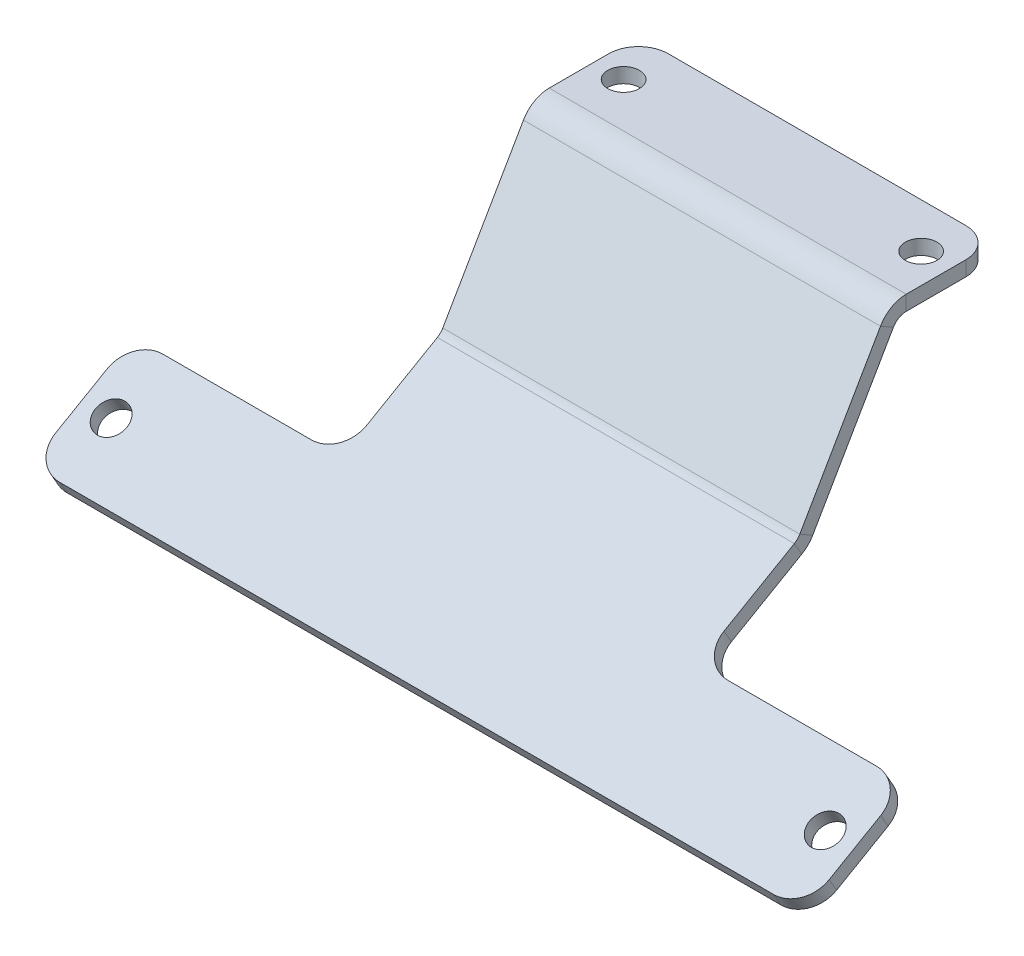
ISO-10303-21;
HEADER;
FILE_DESCRIPTION(('STEP AP214'),'2;1');
FILE_NAME('part.step','',(''),(''),'','','');
FILE_SCHEMA(('AUTOMOTIVE_DESIGN { 1 0 10303 214 1 1 1 1 }'));
ENDSEC;
DATA;
#1=APPLICATION_CONTEXT('core data for automotive mechanical design processes');
#2=APPLICATION_PROTOCOL_DEFINITION('international standard','automotive_design',2000,#1);
#3=PRODUCT_CONTEXT('',#1,'mechanical');
#4=PRODUCT('Part','Part','',(#3));
#5=PRODUCT_RELATED_PRODUCT_CATEGORY('part','',(#4));
#6=PRODUCT_DEFINITION_FORMATION('','',#4);
#7=PRODUCT_DEFINITION_CONTEXT('part definition',#1,'design');
#8=PRODUCT_DEFINITION('design','',#6,#7);
#9=PRODUCT_DEFINITION_SHAPE('','',#8);
#10=(LENGTH_UNIT() NAMED_UNIT(*) SI_UNIT(.MILLI.,.METRE.));
#11=(NAMED_UNIT(*) PLANE_ANGLE_UNIT() SI_UNIT($,.RADIAN.));
#12=(NAMED_UNIT(*) SI_UNIT($,.STERADIAN.) SOLID_ANGLE_UNIT());
#13=UNCERTAINTY_MEASURE_WITH_UNIT(LENGTH_MEASURE(1.E-05),#10,'distance_accuracy_value','');
#14=(GEOMETRIC_REPRESENTATION_CONTEXT(3) GLOBAL_UNCERTAINTY_ASSIGNED_CONTEXT((#13)) GLOBAL_UNIT_ASSIGNED_CONTEXT((#10,
#11,#12)) REPRESENTATION_CONTEXT('',''));
#15=CARTESIAN_POINT('',(0.,0.,0.));
#16=DIRECTION('',(0.,0.,1.));
#17=DIRECTION('',(1.,0.,0.));
#18=AXIS2_PLACEMENT_3D('',#15,#16,#17);
#19=CARTESIAN_POINT('',(-38.1,-3.175,0.));
#20=DIRECTION('',(-1.,0.,0.));
#21=DIRECTION('',(0.,0.,1.));
#22=AXIS2_PLACEMENT_3D('',#19,#20,#21);
#23=PLANE('',#22);
#24=DIRECTION('',(0.,0.,1.));
#25=VECTOR('',#24,1.);
#26=CARTESIAN_POINT('',(-38.1,0.,0.));
#27=LINE('',#26,#25);
#28=CARTESIAN_POINT('',(-38.1,0.,6.35));
#29=VERTEX_POINT('',#28);
#30=CARTESIAN_POINT('',(-38.1,0.,19.05));
#31=VERTEX_POINT('',#30);
#32=EDGE_CURVE('E339',#29,#31,#27,.T.);
#33=ORIENTED_EDGE('',*,*,#32,.F.);
#34=DIRECTION('',(0.,1.,0.));
#35=VECTOR('',#34,1.);
#36=CARTESIAN_POINT('',(-38.1,-3.175,6.35));
#37=LINE('',#36,#35);
#38=CARTESIAN_POINT('',(-38.1,-3.175,6.35));
#39=VERTEX_POINT('',#38);
#40=EDGE_CURVE('E104',#29,#39,#37,.F.);
#41=ORIENTED_EDGE('',*,*,#40,.T.);
#42=DIRECTION('',(0.,0.,1.));
#43=VECTOR('',#42,1.);
#44=CARTESIAN_POINT('',(-38.1,-3.175,0.));
#45=LINE('',#44,#43);
#46=CARTESIAN_POINT('',(-38.1,-3.17499999999999,19.05));
#47=VERTEX_POINT('',#46);
#48=EDGE_CURVE('E348',#39,#47,#45,.T.);
#49=ORIENTED_EDGE('',*,*,#48,.T.);
#50=DIRECTION('',(0.,1.,0.));
#51=VECTOR('',#50,1.);
#52=CARTESIAN_POINT('',(-38.1,-3.175,19.05));
#53=LINE('',#52,#51);
#54=EDGE_CURVE('E358',#47,#31,#53,.T.);
#55=ORIENTED_EDGE('',*,*,#54,.T.);
#56=EDGE_LOOP('',(#33,#41,#49,#55));
#57=FACE_BOUND('',#56,.T.);
#58=ADVANCED_FACE('F81',(#57),#23,.T.);
#59=CARTESIAN_POINT('',(-38.1,-3.175,0.));
#60=DIRECTION('',(0.,0.,-1.));
#61=DIRECTION('',(-1.,0.,0.));
#62=AXIS2_PLACEMENT_3D('',#59,#60,#61);
#63=PLANE('',#62);
#64=DIRECTION('',(-1.,0.,0.));
#65=VECTOR('',#64,1.);
#66=CARTESIAN_POINT('',(-38.1,-3.175,0.));
#67=LINE('',#66,#65);
#68=CARTESIAN_POINT('',(31.75,-3.175,0.));
#69=VERTEX_POINT('',#68);
#70=CARTESIAN_POINT('',(-31.75,-3.175,0.));
#71=VERTEX_POINT('',#70);
#72=EDGE_CURVE('E355',#69,#71,#67,.T.);
#73=ORIENTED_EDGE('',*,*,#72,.T.);
#74=DIRECTION('',(0.,1.,0.));
#75=VECTOR('',#74,1.);
#76=CARTESIAN_POINT('',(-31.75,-3.175,0.));
#77=LINE('',#76,#75);
#78=CARTESIAN_POINT('',(-31.75,0.,0.));
#79=VERTEX_POINT('',#78);
#80=EDGE_CURVE('E419',#71,#79,#77,.T.);
#81=ORIENTED_EDGE('',*,*,#80,.T.);
#82=DIRECTION('',(-1.,0.,0.));
#83=VECTOR('',#82,1.);
#84=CARTESIAN_POINT('',(-38.1,0.,0.));
#85=LINE('',#84,#83);
#86=CARTESIAN_POINT('',(31.75,0.,0.));
#87=VERTEX_POINT('',#86);
#88=EDGE_CURVE('E351',#87,#79,#85,.T.);
#89=ORIENTED_EDGE('',*,*,#88,.F.);
#90=DIRECTION('',(0.,1.,0.));
#91=VECTOR('',#90,1.);
#92=CARTESIAN_POINT('',(31.75,-3.175,0.));
#93=LINE('',#92,#91);
#94=EDGE_CURVE('E417',#87,#69,#93,.F.);
#95=ORIENTED_EDGE('',*,*,#94,.T.);
#96=EDGE_LOOP('',(#73,#81,#89,#95));
#97=FACE_BOUND('',#96,.T.);
#98=ADVANCED_FACE('F498',(#97),#63,.T.);
#99=CARTESIAN_POINT('',(38.1,-3.175,0.));
#100=DIRECTION('',(1.,0.,0.));
#101=DIRECTION('',(0.,0.,-1.));
#102=AXIS2_PLACEMENT_3D('',#99,#100,#101);
#103=PLANE('',#102);
#104=DIRECTION('',(0.,0.,-1.));
#105=VECTOR('',#104,1.);
#106=CARTESIAN_POINT('',(38.1,-3.175,0.));
#107=LINE('',#106,#105);
#108=CARTESIAN_POINT('',(38.1,-3.17499999999999,19.05));
#109=VERTEX_POINT('',#108);
#110=CARTESIAN_POINT('',(38.1,-3.175,6.35));
#111=VERTEX_POINT('',#110);
#112=EDGE_CURVE('E353',#109,#111,#107,.T.);
#113=ORIENTED_EDGE('',*,*,#112,.T.);
#114=DIRECTION('',(0.,1.,0.));
#115=VECTOR('',#114,1.);
#116=CARTESIAN_POINT('',(38.1,-3.175,6.35));
#117=LINE('',#116,#115);
#118=CARTESIAN_POINT('',(38.1,0.,6.35));
#119=VERTEX_POINT('',#118);
#120=EDGE_CURVE('E430',#111,#119,#117,.T.);
#121=ORIENTED_EDGE('',*,*,#120,.T.);
#122=DIRECTION('',(0.,0.,-1.));
#123=VECTOR('',#122,1.);
#124=CARTESIAN_POINT('',(38.1,0.,0.));
#125=LINE('',#124,#123);
#126=CARTESIAN_POINT('',(38.1,0.,19.05));
#127=VERTEX_POINT('',#126);
#128=EDGE_CURVE('E363',#127,#119,#125,.T.);
#129=ORIENTED_EDGE('',*,*,#128,.F.);
#130=DIRECTION('',(0.,1.,0.));
#131=VECTOR('',#130,1.);
#132=CARTESIAN_POINT('',(38.1,-3.175,19.05));
#133=LINE('',#132,#131);
#134=EDGE_CURVE('E368',#109,#127,#133,.T.);
#135=ORIENTED_EDGE('',*,*,#134,.F.);
#136=EDGE_LOOP('',(#113,#121,#129,#135));
#137=FACE_BOUND('',#136,.T.);
#138=ADVANCED_FACE('F503',(#137),#103,.T.);
#139=CARTESIAN_POINT('',(0.,-3.175,0.));
#140=DIRECTION('',(0.,1.,0.));
#141=DIRECTION('',(0.,0.,1.));
#142=AXIS2_PLACEMENT_3D('',#139,#140,#141);
#143=PLANE('',#142);
#144=CARTESIAN_POINT('',(-31.75,-3.175,9.525));
#145=DIRECTION('',(0.,1.,0.));
#146=DIRECTION('',(0.,0.,1.));
#147=AXIS2_PLACEMENT_3D('',#144,#145,#146);
#148=CIRCLE('',#147,3.37819999999999);
#149=CARTESIAN_POINT('',(-31.75,-3.175,12.9032));
#150=VERTEX_POINT('',#149);
#151=EDGE_CURVE('E471',#150,#150,#148,.T.);
#152=ORIENTED_EDGE('',*,*,#151,.T.);
#153=EDGE_LOOP('',(#152));
#154=FACE_BOUND('',#153,.T.);
#155=CARTESIAN_POINT('',(31.75,-3.175,9.525));
#156=DIRECTION('',(0.,1.,0.));
#157=DIRECTION('',(0.,0.,1.));
#158=AXIS2_PLACEMENT_3D('',#155,#156,#157);
#159=CIRCLE('',#158,3.37819999999998);
#160=CARTESIAN_POINT('',(31.75,-3.175,12.9032));
#161=VERTEX_POINT('',#160);
#162=EDGE_CURVE('E301',#161,#161,#159,.T.);
#163=ORIENTED_EDGE('',*,*,#162,.T.);
#164=EDGE_LOOP('',(#163));
#165=FACE_BOUND('',#164,.T.);
#166=ORIENTED_EDGE('',*,*,#48,.F.);
#167=CARTESIAN_POINT('',(-31.75,-3.175,6.35));
#168=DIRECTION('',(0.,1.,0.));
#169=DIRECTION('',(0.,0.,1.));
#170=AXIS2_PLACEMENT_3D('',#167,#168,#169);
#171=CIRCLE('',#170,6.35);
#172=EDGE_CURVE('E428',#39,#71,#171,.F.);
#173=ORIENTED_EDGE('',*,*,#172,.T.);
#174=ORIENTED_EDGE('',*,*,#72,.F.);
#175=CARTESIAN_POINT('',(31.75,-3.175,6.35));
#176=DIRECTION('',(0.,1.,0.));
#177=DIRECTION('',(0.,0.,1.));
#178=AXIS2_PLACEMENT_3D('',#175,#176,#177);
#179=CIRCLE('',#178,6.35);
#180=EDGE_CURVE('E96',#69,#111,#179,.F.);
#181=ORIENTED_EDGE('',*,*,#180,.T.);
#182=ORIENTED_EDGE('',*,*,#112,.F.);
#183=DIRECTION('',(1.,0.,0.));
#184=VECTOR('',#183,1.);
#185=CARTESIAN_POINT('',(-38.1,-3.175,19.05));
#186=LINE('',#185,#184);
#187=EDGE_CURVE('E350',#47,#109,#186,.T.);
#188=ORIENTED_EDGE('',*,*,#187,.F.);
#189=EDGE_LOOP('',(#166,#173,#174,#181,#182,#188));
#190=FACE_BOUND('',#189,.T.);
#191=ADVANCED_FACE('F479',(#154,#165,#190),#143,.F.);
#192=CARTESIAN_POINT('',(0.,0.,0.));
#193=DIRECTION('',(0.,1.,0.));
#194=DIRECTION('',(0.,0.,1.));
#195=AXIS2_PLACEMENT_3D('',#192,#193,#194);
#196=PLANE('',#195);
#197=CARTESIAN_POINT('',(-31.75,0.,9.525));
#198=DIRECTION('',(0.,1.,0.));
#199=DIRECTION('',(0.,0.,1.));
#200=AXIS2_PLACEMENT_3D('',#197,#198,#199);
#201=CIRCLE('',#200,3.37819999999999);
#202=CARTESIAN_POINT('',(-31.75,0.,12.9032));
#203=VERTEX_POINT('',#202);
#204=EDGE_CURVE('E468',#203,#203,#201,.T.);
#205=ORIENTED_EDGE('',*,*,#204,.F.);
#206=EDGE_LOOP('',(#205));
#207=FACE_BOUND('',#206,.T.);
#208=CARTESIAN_POINT('',(31.75,0.,9.525));
#209=DIRECTION('',(0.,1.,0.));
#210=DIRECTION('',(0.,0.,1.));
#211=AXIS2_PLACEMENT_3D('',#208,#209,#210);
#212=CIRCLE('',#211,3.37819999999998);
#213=CARTESIAN_POINT('',(31.75,0.,12.9032));
#214=VERTEX_POINT('',#213);
#215=EDGE_CURVE('E474',#214,#214,#212,.T.);
#216=ORIENTED_EDGE('',*,*,#215,.F.);
#217=EDGE_LOOP('',(#216));
#218=FACE_BOUND('',#217,.T.);
#219=ORIENTED_EDGE('',*,*,#88,.T.);
#220=CARTESIAN_POINT('',(-31.75,0.,6.35));
#221=DIRECTION('',(0.,1.,0.));
#222=DIRECTION('',(0.,0.,1.));
#223=AXIS2_PLACEMENT_3D('',#220,#221,#222);
#224=CIRCLE('',#223,6.35);
#225=EDGE_CURVE('E424',#79,#29,#224,.T.);
#226=ORIENTED_EDGE('',*,*,#225,.T.);
#227=ORIENTED_EDGE('',*,*,#32,.T.);
#228=DIRECTION('',(1.,0.,0.));
#229=VECTOR('',#228,1.);
#230=CARTESIAN_POINT('',(-38.1,0.,19.05));
#231=LINE('',#230,#229);
#232=EDGE_CURVE('E360',#31,#127,#231,.T.);
#233=ORIENTED_EDGE('',*,*,#232,.T.);
#234=ORIENTED_EDGE('',*,*,#128,.T.);
#235=CARTESIAN_POINT('',(31.75,0.,6.35));
#236=DIRECTION('',(0.,1.,0.));
#237=DIRECTION('',(0.,0.,1.));
#238=AXIS2_PLACEMENT_3D('',#235,#236,#237);
#239=CIRCLE('',#238,6.35);
#240=EDGE_CURVE('E422',#119,#87,#239,.T.);
#241=ORIENTED_EDGE('',*,*,#240,.T.);
#242=EDGE_LOOP('',(#219,#226,#227,#233,#234,#241));
#243=FACE_BOUND('',#242,.T.);
#244=ADVANCED_FACE('F547',(#207,#218,#243),#196,.T.);
#245=CARTESIAN_POINT('',(38.1,-6.35,19.05));
#246=DIRECTION('',(1.,0.,0.));
#247=DIRECTION('',(0.,0.,-1.));
#248=AXIS2_PLACEMENT_3D('',#245,#246,#247);
#249=PLANE('',#248);
#250=DIRECTION('',(0.,-0.500000000000004,-0.866025403784436));
#251=VECTOR('',#250,1.);
#252=CARTESIAN_POINT('',(38.1,-3.17499999999998,24.5492613140312));
#253=LINE('',#252,#251);
#254=CARTESIAN_POINT('',(38.1,-4.76249999999998,21.7996306570156));
#255=VERTEX_POINT('',#254);
#256=CARTESIAN_POINT('',(38.1,-3.17499999999997,24.5492613140312));
#257=VERTEX_POINT('',#256);
#258=EDGE_CURVE('E302',#255,#257,#253,.F.);
#259=ORIENTED_EDGE('',*,*,#258,.F.);
#260=CARTESIAN_POINT('',(38.1,-6.35,19.05));
#261=DIRECTION('',(-1.,0.,0.));
#262=DIRECTION('',(0.,0.,1.));
#263=AXIS2_PLACEMENT_3D('',#260,#261,#262);
#264=CIRCLE('',#263,3.17500000000001);
#265=EDGE_CURVE('E343',#109,#255,#264,.F.);
#266=ORIENTED_EDGE('',*,*,#265,.F.);
#267=ORIENTED_EDGE('',*,*,#134,.T.);
#268=CARTESIAN_POINT('',(38.1,-6.35,19.05));
#269=DIRECTION('',(-1.,0.,0.));
#270=DIRECTION('',(0.,0.,1.));
#271=AXIS2_PLACEMENT_3D('',#268,#269,#270);
#272=CIRCLE('',#271,6.35000000000001);
#273=EDGE_CURVE('E336',#127,#257,#272,.F.);
#274=ORIENTED_EDGE('',*,*,#273,.T.);
#275=EDGE_LOOP('',(#259,#266,#267,#274));
#276=FACE_BOUND('',#275,.T.);
#277=ADVANCED_FACE('F748',(#276),#249,.T.);
#278=CARTESIAN_POINT('',(-38.1,-6.35,19.05));
#279=DIRECTION('',(1.,0.,0.));
#280=DIRECTION('',(0.,0.,-1.));
#281=AXIS2_PLACEMENT_3D('',#278,#279,#280);
#282=PLANE('',#281);
#283=CARTESIAN_POINT('',(-38.1,-6.35,19.05));
#284=DIRECTION('',(-1.,0.,0.));
#285=DIRECTION('',(0.,0.,1.));
#286=AXIS2_PLACEMENT_3D('',#283,#284,#285);
#287=CIRCLE('',#286,3.17500000000001);
#288=CARTESIAN_POINT('',(-38.1,-4.76249999999998,21.7996306570156));
#289=VERTEX_POINT('',#288);
#290=EDGE_CURVE('E310',#289,#47,#287,.T.);
#291=ORIENTED_EDGE('',*,*,#290,.F.);
#292=DIRECTION('',(0.,-0.500000000000004,-0.866025403784436));
#293=VECTOR('',#292,1.);
#294=CARTESIAN_POINT('',(-38.1,-4.76249999999999,21.7996306570156));
#295=LINE('',#294,#293);
#296=CARTESIAN_POINT('',(-38.1,-3.17499999999997,24.5492613140312));
#297=VERTEX_POINT('',#296);
#298=EDGE_CURVE('E329',#289,#297,#295,.F.);
#299=ORIENTED_EDGE('',*,*,#298,.T.);
#300=CARTESIAN_POINT('',(-38.1,-6.35,19.05));
#301=DIRECTION('',(-1.,0.,0.));
#302=DIRECTION('',(0.,0.,1.));
#303=AXIS2_PLACEMENT_3D('',#300,#301,#302);
#304=CIRCLE('',#303,6.35000000000001);
#305=EDGE_CURVE('E340',#297,#31,#304,.T.);
#306=ORIENTED_EDGE('',*,*,#305,.T.);
#307=ORIENTED_EDGE('',*,*,#54,.F.);
#308=EDGE_LOOP('',(#291,#299,#306,#307));
#309=FACE_BOUND('',#308,.T.);
#310=ADVANCED_FACE('F554',(#309),#282,.F.);
#311=CARTESIAN_POINT('',(-38.1,-6.35,19.05));
#312=DIRECTION('',(-1.,0.,0.));
#313=DIRECTION('',(0.,0.500000000000004,0.866025403784436));
#314=AXIS2_PLACEMENT_3D('',#311,#312,#313);
#315=CYLINDRICAL_SURFACE('',#314,6.35000000000001);
#316=ORIENTED_EDGE('',*,*,#232,.F.);
#317=ORIENTED_EDGE('',*,*,#305,.F.);
#318=DIRECTION('',(-1.,0.,0.));
#319=VECTOR('',#318,1.);
#320=CARTESIAN_POINT('',(38.1,-3.17499999999997,24.5492613140312));
#321=LINE('',#320,#319);
#322=EDGE_CURVE('E327',#297,#257,#321,.F.);
#323=ORIENTED_EDGE('',*,*,#322,.T.);
#324=ORIENTED_EDGE('',*,*,#273,.F.);
#325=EDGE_LOOP('',(#316,#317,#323,#324));
#326=FACE_BOUND('',#325,.T.);
#327=ADVANCED_FACE('F550',(#326),#315,.T.);
#328=CARTESIAN_POINT('',(-38.1,-6.35,19.05));
#329=DIRECTION('',(-1.,0.,0.));
#330=DIRECTION('',(0.,0.500000000000004,0.866025403784436));
#331=AXIS2_PLACEMENT_3D('',#328,#329,#330);
#332=CYLINDRICAL_SURFACE('',#331,3.17500000000001);
#333=ORIENTED_EDGE('',*,*,#187,.T.);
#334=ORIENTED_EDGE('',*,*,#265,.T.);
#335=DIRECTION('',(-1.,0.,0.));
#336=VECTOR('',#335,1.);
#337=CARTESIAN_POINT('',(38.1,-4.76249999999999,21.7996306570156));
#338=LINE('',#337,#336);
#339=EDGE_CURVE('E332',#255,#289,#338,.T.);
#340=ORIENTED_EDGE('',*,*,#339,.T.);
#341=ORIENTED_EDGE('',*,*,#290,.T.);
#342=EDGE_LOOP('',(#333,#334,#340,#341));
#343=FACE_BOUND('',#342,.T.);
#344=ADVANCED_FACE('F893',(#343),#332,.F.);
#345=CARTESIAN_POINT('',(-38.1,-32.995567884187,41.7661742093543));
#346=DIRECTION('',(1.,0.,0.));
#347=DIRECTION('',(0.,0.,-1.));
#348=AXIS2_PLACEMENT_3D('',#345,#346,#347);
#349=PLANE('',#348);
#350=ORIENTED_EDGE('',*,*,#298,.F.);
#351=DIRECTION('',(0.,0.866025403784436,-0.500000000000004));
#352=VECTOR('',#351,1.);
#353=CARTESIAN_POINT('',(-38.1,-34.583067884187,39.0165435523387));
#354=LINE('',#353,#352);
#355=CARTESIAN_POINT('',(-38.1,-34.583067884187,39.0165435523387));
#356=VERTEX_POINT('',#355);
#357=EDGE_CURVE('E325',#289,#356,#354,.F.);
#358=ORIENTED_EDGE('',*,*,#357,.T.);
#359=DIRECTION('',(0.,-0.500000000000004,-0.866025403784436));
#360=VECTOR('',#359,1.);
#361=CARTESIAN_POINT('',(-38.1,-32.995567884187,41.7661742093543));
#362=LINE('',#361,#360);
#363=CARTESIAN_POINT('',(-38.1,-32.995567884187,41.7661742093543));
#364=VERTEX_POINT('',#363);
#365=EDGE_CURVE('E307',#364,#356,#362,.T.);
#366=ORIENTED_EDGE('',*,*,#365,.F.);
#367=DIRECTION('',(0.,-0.866025403784436,0.500000000000004));
#368=VECTOR('',#367,1.);
#369=CARTESIAN_POINT('',(-38.1,9.04264197104682,17.4954024331848));
#370=LINE('',#369,#368);
#371=EDGE_CURVE('E319',#297,#364,#370,.T.);
#372=ORIENTED_EDGE('',*,*,#371,.F.);
#373=EDGE_LOOP('',(#350,#358,#366,#372));
#374=FACE_BOUND('',#373,.T.);
#375=ADVANCED_FACE('F564',(#374),#349,.F.);
#376=CARTESIAN_POINT('',(38.1,-1.58749999999999,23.6327177616926));
#377=DIRECTION('',(-1.,0.,0.));
#378=DIRECTION('',(0.,0.,1.));
#379=AXIS2_PLACEMENT_3D('',#376,#377,#378);
#380=PLANE('',#379);
#381=ORIENTED_EDGE('',*,*,#258,.T.);
#382=DIRECTION('',(0.,0.866025403784436,-0.500000000000004));
#383=VECTOR('',#382,1.);
#384=CARTESIAN_POINT('',(38.1,9.04264197104682,17.4954024331848));
#385=LINE('',#384,#383);
#386=CARTESIAN_POINT('',(38.1,-32.995567884187,41.7661742093543));
#387=VERTEX_POINT('',#386);
#388=EDGE_CURVE('E314',#387,#257,#385,.T.);
#389=ORIENTED_EDGE('',*,*,#388,.F.);
#390=DIRECTION('',(0.,-0.500000000000004,-0.866025403784436));
#391=VECTOR('',#390,1.);
#392=CARTESIAN_POINT('',(38.1,-32.995567884187,41.7661742093543));
#393=LINE('',#392,#391);
#394=CARTESIAN_POINT('',(38.1,-34.583067884187,39.0165435523387));
#395=VERTEX_POINT('',#394);
#396=EDGE_CURVE('E311',#387,#395,#393,.T.);
#397=ORIENTED_EDGE('',*,*,#396,.T.);
#398=DIRECTION('',(0.,-0.866025403784436,0.500000000000004));
#399=VECTOR('',#398,1.);
#400=CARTESIAN_POINT('',(38.1,-3.175,20.8830871046771));
#401=LINE('',#400,#399);
#402=EDGE_CURVE('E321',#395,#255,#401,.F.);
#403=ORIENTED_EDGE('',*,*,#402,.T.);
#404=EDGE_LOOP('',(#381,#389,#397,#403));
#405=FACE_BOUND('',#404,.T.);
#406=ADVANCED_FACE('F873',(#405),#380,.F.);
#407=CARTESIAN_POINT('',(0.,9.04264197104682,17.4954024331848));
#408=DIRECTION('',(0.,-0.500000000000004,-0.866025403784436));
#409=DIRECTION('',(0.,0.866025403784436,-0.500000000000004));
#410=AXIS2_PLACEMENT_3D('',#407,#408,#409);
#411=PLANE('',#410);
#412=ORIENTED_EDGE('',*,*,#322,.F.);
#413=ORIENTED_EDGE('',*,*,#371,.T.);
#414=DIRECTION('',(1.,0.,0.));
#415=VECTOR('',#414,1.);
#416=CARTESIAN_POINT('',(0.,-32.995567884187,41.7661742093543));
#417=LINE('',#416,#415);
#418=EDGE_CURVE('E317',#364,#387,#417,.T.);
#419=ORIENTED_EDGE('',*,*,#418,.T.);
#420=ORIENTED_EDGE('',*,*,#388,.T.);
#421=EDGE_LOOP('',(#412,#413,#419,#420));
#422=FACE_BOUND('',#421,.T.);
#423=ADVANCED_FACE('F561',(#422),#411,.F.);
#424=CARTESIAN_POINT('',(0.,7.45514197104681,14.7457717761692));
#425=DIRECTION('',(0.,-0.500000000000004,-0.866025403784436));
#426=DIRECTION('',(0.,0.866025403784436,-0.500000000000004));
#427=AXIS2_PLACEMENT_3D('',#424,#425,#426);
#428=PLANE('',#427);
#429=ORIENTED_EDGE('',*,*,#357,.F.);
#430=ORIENTED_EDGE('',*,*,#339,.F.);
#431=ORIENTED_EDGE('',*,*,#402,.F.);
#432=DIRECTION('',(-1.,0.,0.));
#433=VECTOR('',#432,1.);
#434=CARTESIAN_POINT('',(38.1,-34.583067884187,39.0165435523387));
#435=LINE('',#434,#433);
#436=EDGE_CURVE('E253',#356,#395,#435,.F.);
#437=ORIENTED_EDGE('',*,*,#436,.F.);
#438=EDGE_LOOP('',(#429,#430,#431,#437));
#439=FACE_BOUND('',#438,.T.);
#440=ADVANCED_FACE('F853',(#439),#428,.T.);
#441=CARTESIAN_POINT('',(-38.1,-31.408067884187,44.5158048663698));
#442=DIRECTION('',(-1.,0.,0.));
#443=DIRECTION('',(0.,0.,1.));
#444=AXIS2_PLACEMENT_3D('',#441,#442,#443);
#445=PLANE('',#444);
#446=DIRECTION('',(0.,0.866025403784438,0.500000000000001));
#447=VECTOR('',#446,1.);
#448=CARTESIAN_POINT('',(-38.1,-36.9073291982182,41.3408048663698));
#449=LINE('',#448,#447);
#450=CARTESIAN_POINT('',(-38.1,-34.1576985412026,42.9283048663698));
#451=VERTEX_POINT('',#450);
#452=CARTESIAN_POINT('',(-38.1,-36.9073291982182,41.3408048663698));
#453=VERTEX_POINT('',#452);
#454=EDGE_CURVE('E298',#451,#453,#449,.F.);
#455=ORIENTED_EDGE('',*,*,#454,.F.);
#456=CARTESIAN_POINT('',(-38.1,-31.408067884187,44.5158048663698));
#457=DIRECTION('',(1.,0.,0.));
#458=DIRECTION('',(0.,0.,-1.));
#459=AXIS2_PLACEMENT_3D('',#456,#457,#458);
#460=CIRCLE('',#459,3.175);
#461=EDGE_CURVE('E257',#364,#451,#460,.F.);
#462=ORIENTED_EDGE('',*,*,#461,.F.);
#463=ORIENTED_EDGE('',*,*,#365,.T.);
#464=CARTESIAN_POINT('',(-38.1,-31.408067884187,44.5158048663698));
#465=DIRECTION('',(1.,0.,0.));
#466=DIRECTION('',(0.,0.,-1.));
#467=AXIS2_PLACEMENT_3D('',#464,#465,#466);
#468=CIRCLE('',#467,6.35);
#469=EDGE_CURVE('E256',#356,#453,#468,.F.);
#470=ORIENTED_EDGE('',*,*,#469,.T.);
#471=EDGE_LOOP('',(#455,#462,#463,#470));
#472=FACE_BOUND('',#471,.T.);
#473=ADVANCED_FACE('F571',(#472),#445,.T.);
#474=CARTESIAN_POINT('',(38.1,-31.408067884187,44.5158048663698));
#475=DIRECTION('',(-1.,0.,0.));
#476=DIRECTION('',(0.,0.,1.));
#477=AXIS2_PLACEMENT_3D('',#474,#475,#476);
#478=PLANE('',#477);
#479=CARTESIAN_POINT('',(38.1,-31.408067884187,44.5158048663698));
#480=DIRECTION('',(1.,0.,0.));
#481=DIRECTION('',(0.,0.,-1.));
#482=AXIS2_PLACEMENT_3D('',#479,#480,#481);
#483=CIRCLE('',#482,3.175);
#484=CARTESIAN_POINT('',(38.1,-34.1576985412026,42.9283048663698));
#485=VERTEX_POINT('',#484);
#486=EDGE_CURVE('E264',#485,#387,#483,.T.);
#487=ORIENTED_EDGE('',*,*,#486,.F.);
#488=DIRECTION('',(0.,0.866025403784438,0.500000000000001));
#489=VECTOR('',#488,1.);
#490=CARTESIAN_POINT('',(38.1,-34.1576985412026,42.9283048663698));
#491=LINE('',#490,#489);
#492=CARTESIAN_POINT('',(38.1,-36.9073291982182,41.3408048663698));
#493=VERTEX_POINT('',#492);
#494=EDGE_CURVE('E261',#485,#493,#491,.F.);
#495=ORIENTED_EDGE('',*,*,#494,.T.);
#496=CARTESIAN_POINT('',(38.1,-31.408067884187,44.5158048663698));
#497=DIRECTION('',(1.,0.,0.));
#498=DIRECTION('',(0.,0.,-1.));
#499=AXIS2_PLACEMENT_3D('',#496,#497,#498);
#500=CIRCLE('',#499,6.35);
#501=EDGE_CURVE('E245',#493,#395,#500,.T.);
#502=ORIENTED_EDGE('',*,*,#501,.T.);
#503=ORIENTED_EDGE('',*,*,#396,.F.);
#504=EDGE_LOOP('',(#487,#495,#502,#503));
#505=FACE_BOUND('',#504,.T.);
#506=ADVANCED_FACE('F262',(#505),#478,.F.);
#507=CARTESIAN_POINT('',(38.1,-31.408067884187,44.5158048663698));
#508=DIRECTION('',(1.,0.,0.));
#509=DIRECTION('',(0.,-0.866025403784438,-0.500000000000001));
#510=AXIS2_PLACEMENT_3D('',#507,#508,#509);
#511=CYLINDRICAL_SURFACE('',#510,6.35);
#512=ORIENTED_EDGE('',*,*,#436,.T.);
#513=ORIENTED_EDGE('',*,*,#501,.F.);
#514=DIRECTION('',(1.,0.,0.));
#515=VECTOR('',#514,1.);
#516=CARTESIAN_POINT('',(-38.1,-36.9073291982182,41.3408048663698));
#517=LINE('',#516,#515);
#518=EDGE_CURVE('E250',#493,#453,#517,.F.);
#519=ORIENTED_EDGE('',*,*,#518,.T.);
#520=ORIENTED_EDGE('',*,*,#469,.F.);
#521=EDGE_LOOP('',(#512,#513,#519,#520));
#522=FACE_BOUND('',#521,.T.);
#523=ADVANCED_FACE('F247',(#522),#511,.T.);
#524=CARTESIAN_POINT('',(38.1,-31.408067884187,44.5158048663698));
#525=DIRECTION('',(1.,0.,0.));
#526=DIRECTION('',(0.,-0.866025403784438,-0.500000000000001));
#527=AXIS2_PLACEMENT_3D('',#524,#525,#526);
#528=CYLINDRICAL_SURFACE('',#527,3.175);
#529=ORIENTED_EDGE('',*,*,#418,.F.);
#530=ORIENTED_EDGE('',*,*,#461,.T.);
#531=DIRECTION('',(1.,0.,0.));
#532=VECTOR('',#531,1.);
#533=CARTESIAN_POINT('',(-38.1,-34.1576985412026,42.9283048663698));
#534=LINE('',#533,#532);
#535=EDGE_CURVE('E269',#451,#485,#534,.T.);
#536=ORIENTED_EDGE('',*,*,#535,.T.);
#537=ORIENTED_EDGE('',*,*,#486,.T.);
#538=EDGE_LOOP('',(#529,#530,#536,#537));
#539=FACE_BOUND('',#538,.T.);
#540=ADVANCED_FACE('F569',(#539),#528,.F.);
#541=CARTESIAN_POINT('',(-38.1,-36.4819598552338,40.6040435523387));
#542=DIRECTION('',(1.,0.,0.));
#543=DIRECTION('',(0.,0.,-1.));
#544=AXIS2_PLACEMENT_3D('',#541,#542,#543);
#545=PLANE('',#544);
#546=DIRECTION('',(0.,0.500000000000001,-0.866025403784438));
#547=VECTOR('',#546,1.);
#548=CARTESIAN_POINT('',(-38.1,-10.1477839420934,-5.00808710467697));
#549=LINE('',#548,#547);
#550=CARTESIAN_POINT('',(-38.1,-45.5815905122494,56.365066180401));
#551=VERTEX_POINT('',#550);
#552=EDGE_CURVE('E277',#551,#453,#549,.T.);
#553=ORIENTED_EDGE('',*,*,#552,.F.);
#554=DIRECTION('',(0.,0.866025403784438,0.500000000000001));
#555=VECTOR('',#554,1.);
#556=CARTESIAN_POINT('',(-38.1,-45.5815905122494,56.365066180401));
#557=LINE('',#556,#555);
#558=CARTESIAN_POINT('',(-38.1,-42.8319598552338,57.952566180401));
#559=VERTEX_POINT('',#558);
#560=EDGE_CURVE('E371',#551,#559,#557,.T.);
#561=ORIENTED_EDGE('',*,*,#560,.T.);
#562=DIRECTION('',(0.,-0.500000000000001,0.866025403784438));
#563=VECTOR('',#562,1.);
#564=CARTESIAN_POINT('',(-38.1,-33.7323291982182,42.1915435523387));
#565=LINE('',#564,#563);
#566=EDGE_CURVE('E278',#559,#451,#565,.F.);
#567=ORIENTED_EDGE('',*,*,#566,.T.);
#568=ORIENTED_EDGE('',*,*,#454,.T.);
#569=EDGE_LOOP('',(#553,#561,#567,#568));
#570=FACE_BOUND('',#569,.T.);
#571=ADVANCED_FACE('F573',(#570),#545,.F.);
#572=CARTESIAN_POINT('',(38.1,-61.4565905122494,83.8613727505569));
#573=DIRECTION('',(-1.,0.,0.));
#574=DIRECTION('',(0.,0.,1.));
#575=AXIS2_PLACEMENT_3D('',#572,#573,#574);
#576=PLANE('',#575);
#577=DIRECTION('',(0.,0.500000000000001,-0.866025403784438));
#578=VECTOR('',#577,1.);
#579=CARTESIAN_POINT('',(38.1,-58.7069598552338,85.4488727505569));
#580=LINE('',#579,#578);
#581=CARTESIAN_POINT('',(38.1,-42.8319598552338,57.952566180401));
#582=VERTEX_POINT('',#581);
#583=EDGE_CURVE('E294',#485,#582,#580,.F.);
#584=ORIENTED_EDGE('',*,*,#583,.T.);
#585=DIRECTION('',(0.,-0.866025403784438,-0.500000000000001));
#586=VECTOR('',#585,1.);
#587=CARTESIAN_POINT('',(38.1,-45.5815905122494,56.365066180401));
#588=LINE('',#587,#586);
#589=CARTESIAN_POINT('',(38.1,-45.5815905122494,56.365066180401));
#590=VERTEX_POINT('',#589);
#591=EDGE_CURVE('E283',#582,#590,#588,.T.);
#592=ORIENTED_EDGE('',*,*,#591,.T.);
#593=DIRECTION('',(0.,-0.500000000000001,0.866025403784438));
#594=VECTOR('',#593,1.);
#595=CARTESIAN_POINT('',(38.1,-10.1477839420934,-5.00808710467697));
#596=LINE('',#595,#594);
#597=EDGE_CURVE('E275',#493,#590,#596,.T.);
#598=ORIENTED_EDGE('',*,*,#597,.F.);
#599=ORIENTED_EDGE('',*,*,#494,.F.);
#600=EDGE_LOOP('',(#584,#592,#598,#599));
#601=FACE_BOUND('',#600,.T.);
#602=ADVANCED_FACE('F281',(#601),#576,.F.);
#603=CARTESIAN_POINT('',(0.,-10.1477839420934,-5.00808710467697));
#604=DIRECTION('',(0.,0.866025403784438,0.500000000000001));
#605=DIRECTION('',(0.,-0.500000000000001,0.866025403784438));
#606=AXIS2_PLACEMENT_3D('',#603,#604,#605);
#607=PLANE('',#606);
#608=CARTESIAN_POINT('',(-76.2,-55.1065905122495,72.8628501224947));
#609=DIRECTION('',(0.,0.866025403784438,0.500000000000001));
#610=DIRECTION('',(0.,-0.500000000000001,0.866025403784438));
#611=AXIS2_PLACEMENT_3D('',#608,#609,#610);
#612=CIRCLE('',#611,3.37819999999998);
#613=CARTESIAN_POINT('',(-76.2,-56.7956905122495,75.7884571415592));
#614=VERTEX_POINT('',#613);
#615=EDGE_CURVE('E610',#614,#614,#612,.T.);
#616=ORIENTED_EDGE('',*,*,#615,.T.);
#617=EDGE_LOOP('',(#616));
#618=FACE_BOUND('',#617,.T.);
#619=CARTESIAN_POINT('',(76.2,-55.1065905122495,72.8628501224947));
#620=DIRECTION('',(0.,0.866025403784438,0.500000000000001));
#621=DIRECTION('',(0.,-0.500000000000001,0.866025403784438));
#622=AXIS2_PLACEMENT_3D('',#619,#620,#621);
#623=CIRCLE('',#622,3.37819999999998);
#624=CARTESIAN_POINT('',(76.2,-56.7956905122495,75.7884571415592));
#625=VERTEX_POINT('',#624);
#626=EDGE_CURVE('E603',#625,#625,#623,.T.);
#627=ORIENTED_EDGE('',*,*,#626,.T.);
#628=EDGE_LOOP('',(#627));
#629=FACE_BOUND('',#628,.T.);
#630=DIRECTION('',(0.,0.500000000000001,-0.866025403784438));
#631=VECTOR('',#630,1.);
#632=CARTESIAN_POINT('',(-82.55,-48.7565905122494,61.8643274944322));
#633=LINE('',#632,#631);
#634=CARTESIAN_POINT('',(-82.55,-58.2815905122494,78.3621114365258));
#635=VERTEX_POINT('',#634);
#636=CARTESIAN_POINT('',(-82.55,-51.9315905122494,67.3635888084634));
#637=VERTEX_POINT('',#636);
#638=EDGE_CURVE('E462',#635,#637,#633,.T.);
#639=ORIENTED_EDGE('',*,*,#638,.T.);
#640=CARTESIAN_POINT('',(-76.2,-51.9315905122494,67.3635888084634));
#641=DIRECTION('',(0.,0.866025403784438,0.500000000000001));
#642=DIRECTION('',(0.,-0.500000000000001,0.866025403784438));
#643=AXIS2_PLACEMENT_3D('',#640,#641,#642);
#644=CIRCLE('',#643,6.35);
#645=CARTESIAN_POINT('',(-76.2,-48.7565905122494,61.8643274944322));
#646=VERTEX_POINT('',#645);
#647=EDGE_CURVE('E405',#637,#646,#644,.F.);
#648=ORIENTED_EDGE('',*,*,#647,.T.);
#649=DIRECTION('',(1.,0.,0.));
#650=VECTOR('',#649,1.);
#651=CARTESIAN_POINT('',(-82.55,-48.7565905122494,61.8643274944322));
#652=LINE('',#651,#650);
#653=CARTESIAN_POINT('',(-44.45,-48.7565905122494,61.8643274944322));
#654=VERTEX_POINT('',#653);
#655=EDGE_CURVE('E447',#646,#654,#652,.T.);
#656=ORIENTED_EDGE('',*,*,#655,.T.);
#657=CARTESIAN_POINT('',(-44.45,-45.5815905122494,56.365066180401));
#658=DIRECTION('',(0.,0.866025403784438,0.500000000000001));
#659=DIRECTION('',(0.,-0.500000000000001,0.866025403784438));
#660=AXIS2_PLACEMENT_3D('',#657,#658,#659);
#661=CIRCLE('',#660,6.35);
#662=EDGE_CURVE('E435',#654,#551,#661,.T.);
#663=ORIENTED_EDGE('',*,*,#662,.T.);
#664=ORIENTED_EDGE('',*,*,#552,.T.);
#665=ORIENTED_EDGE('',*,*,#518,.F.);
#666=ORIENTED_EDGE('',*,*,#597,.T.);
#667=CARTESIAN_POINT('',(44.45,-45.5815905122494,56.365066180401));
#668=DIRECTION('',(0.,0.866025403784438,0.500000000000001));
#669=DIRECTION('',(0.,-0.500000000000001,0.866025403784438));
#670=AXIS2_PLACEMENT_3D('',#667,#668,#669);
#671=CIRCLE('',#670,6.35);
#672=CARTESIAN_POINT('',(44.45,-48.7565905122494,61.8643274944322));
#673=VERTEX_POINT('',#672);
#674=EDGE_CURVE('E89',#590,#673,#671,.T.);
#675=ORIENTED_EDGE('',*,*,#674,.T.);
#676=CARTESIAN_POINT('',(76.2,-48.7565905122494,61.8643274944322));
#677=VERTEX_POINT('',#676);
#678=EDGE_CURVE('E438',#673,#677,#652,.T.);
#679=ORIENTED_EDGE('',*,*,#678,.T.);
#680=CARTESIAN_POINT('',(76.2,-51.9315905122494,67.3635888084634));
#681=DIRECTION('',(0.,0.866025403784438,0.500000000000001));
#682=DIRECTION('',(0.,-0.500000000000001,0.866025403784438));
#683=AXIS2_PLACEMENT_3D('',#680,#681,#682);
#684=CIRCLE('',#683,6.35);
#685=CARTESIAN_POINT('',(82.55,-51.9315905122494,67.3635888084634));
#686=VERTEX_POINT('',#685);
#687=EDGE_CURVE('E399',#677,#686,#684,.F.);
#688=ORIENTED_EDGE('',*,*,#687,.T.);
#689=DIRECTION('',(0.,-0.500000000000001,0.866025403784438));
#690=VECTOR('',#689,1.);
#691=CARTESIAN_POINT('',(82.55,-48.7565905122494,61.8643274944322));
#692=LINE('',#691,#690);
#693=CARTESIAN_POINT('',(82.55,-58.2815905122494,78.3621114365258));
#694=VERTEX_POINT('',#693);
#695=EDGE_CURVE('E448',#686,#694,#692,.T.);
#696=ORIENTED_EDGE('',*,*,#695,.T.);
#697=CARTESIAN_POINT('',(76.2,-58.2815905122494,78.3621114365258));
#698=DIRECTION('',(0.,0.866025403784438,0.500000000000001));
#699=DIRECTION('',(0.,-0.500000000000001,0.866025403784438));
#700=AXIS2_PLACEMENT_3D('',#697,#698,#699);
#701=CIRCLE('',#700,6.35);
#702=CARTESIAN_POINT('',(76.2,-61.4565905122494,83.8613727505569));
#703=VERTEX_POINT('',#702);
#704=EDGE_CURVE('E401',#694,#703,#701,.F.);
#705=ORIENTED_EDGE('',*,*,#704,.T.);
#706=DIRECTION('',(-1.,0.,0.));
#707=VECTOR('',#706,1.);
#708=CARTESIAN_POINT('',(0.,-61.4565905122494,83.8613727505569));
#709=LINE('',#708,#707);
#710=CARTESIAN_POINT('',(-76.2,-61.4565905122494,83.8613727505569));
#711=VERTEX_POINT('',#710);
#712=EDGE_CURVE('E284',#703,#711,#709,.T.);
#713=ORIENTED_EDGE('',*,*,#712,.T.);
#714=CARTESIAN_POINT('',(-76.2,-58.2815905122494,78.3621114365258));
#715=DIRECTION('',(0.,0.866025403784438,0.500000000000001));
#716=DIRECTION('',(0.,-0.500000000000001,0.866025403784438));
#717=AXIS2_PLACEMENT_3D('',#714,#715,#716);
#718=CIRCLE('',#717,6.35);
#719=EDGE_CURVE('E403',#711,#635,#718,.F.);
#720=ORIENTED_EDGE('',*,*,#719,.T.);
#721=EDGE_LOOP('',(#639,#648,#656,#663,#664,#665,#666,#675,#679,#688,#696,#705,#713,#720));
#722=FACE_BOUND('',#721,.T.);
#723=ADVANCED_FACE('F274',(#618,#629,#722),#607,.F.);
#724=CARTESIAN_POINT('',(0.,-7.39815328507776,-3.42058710467696));
#725=DIRECTION('',(0.,0.866025403784438,0.500000000000001));
#726=DIRECTION('',(0.,-0.500000000000001,0.866025403784438));
#727=AXIS2_PLACEMENT_3D('',#724,#725,#726);
#728=PLANE('',#727);
#729=CARTESIAN_POINT('',(-76.2,-52.3569598552339,74.4503501224947));
#730=DIRECTION('',(0.,0.866025403784438,0.500000000000001));
#731=DIRECTION('',(0.,-0.500000000000001,0.866025403784438));
#732=AXIS2_PLACEMENT_3D('',#729,#730,#731);
#733=CIRCLE('',#732,3.37819999999998);
#734=CARTESIAN_POINT('',(-76.2,-54.0460598552339,77.3759571415592));
#735=VERTEX_POINT('',#734);
#736=EDGE_CURVE('E616',#735,#735,#733,.T.);
#737=ORIENTED_EDGE('',*,*,#736,.F.);
#738=EDGE_LOOP('',(#737));
#739=FACE_BOUND('',#738,.T.);
#740=CARTESIAN_POINT('',(76.2,-52.3569598552339,74.4503501224947));
#741=DIRECTION('',(0.,0.866025403784438,0.500000000000001));
#742=DIRECTION('',(0.,-0.500000000000001,0.866025403784438));
#743=AXIS2_PLACEMENT_3D('',#740,#741,#742);
#744=CIRCLE('',#743,3.37819999999998);
#745=CARTESIAN_POINT('',(76.2,-54.0460598552339,77.3759571415592));
#746=VERTEX_POINT('',#745);
#747=EDGE_CURVE('E605',#746,#746,#744,.T.);
#748=ORIENTED_EDGE('',*,*,#747,.F.);
#749=EDGE_LOOP('',(#748));
#750=FACE_BOUND('',#749,.T.);
#751=DIRECTION('',(-1.,0.,0.));
#752=VECTOR('',#751,1.);
#753=CARTESIAN_POINT('',(-82.55,-46.0069598552338,63.4518274944322));
#754=LINE('',#753,#752);
#755=CARTESIAN_POINT('',(-44.45,-46.0069598552338,63.4518274944322));
#756=VERTEX_POINT('',#755);
#757=CARTESIAN_POINT('',(-76.2,-46.0069598552338,63.4518274944322));
#758=VERTEX_POINT('',#757);
#759=EDGE_CURVE('E459',#756,#758,#754,.T.);
#760=ORIENTED_EDGE('',*,*,#759,.T.);
#761=CARTESIAN_POINT('',(-76.2,-49.1819598552338,68.9510888084634));
#762=DIRECTION('',(0.,0.866025403784438,0.500000000000001));
#763=DIRECTION('',(0.,-0.500000000000001,0.866025403784438));
#764=AXIS2_PLACEMENT_3D('',#761,#762,#763);
#765=CIRCLE('',#764,6.35);
#766=CARTESIAN_POINT('',(-82.55,-49.1819598552339,68.9510888084634));
#767=VERTEX_POINT('',#766);
#768=EDGE_CURVE('E392',#758,#767,#765,.T.);
#769=ORIENTED_EDGE('',*,*,#768,.T.);
#770=DIRECTION('',(0.,-0.500000000000001,0.866025403784438));
#771=VECTOR('',#770,1.);
#772=CARTESIAN_POINT('',(-82.55,-46.0069598552338,63.4518274944322));
#773=LINE('',#772,#771);
#774=CARTESIAN_POINT('',(-82.55,-55.5319598552338,79.9496114365257));
#775=VERTEX_POINT('',#774);
#776=EDGE_CURVE('E458',#767,#775,#773,.T.);
#777=ORIENTED_EDGE('',*,*,#776,.T.);
#778=CARTESIAN_POINT('',(-76.2,-55.5319598552338,79.9496114365258));
#779=DIRECTION('',(0.,0.866025403784438,0.500000000000001));
#780=DIRECTION('',(0.,-0.500000000000001,0.866025403784438));
#781=AXIS2_PLACEMENT_3D('',#778,#779,#780);
#782=CIRCLE('',#781,6.35);
#783=CARTESIAN_POINT('',(-76.2,-58.7069598552338,85.4488727505569));
#784=VERTEX_POINT('',#783);
#785=EDGE_CURVE('E390',#775,#784,#782,.T.);
#786=ORIENTED_EDGE('',*,*,#785,.T.);
#787=DIRECTION('',(1.,0.,0.));
#788=VECTOR('',#787,1.);
#789=CARTESIAN_POINT('',(-38.1,-58.7069598552338,85.4488727505569));
#790=LINE('',#789,#788);
#791=CARTESIAN_POINT('',(76.2,-58.7069598552338,85.4488727505569));
#792=VERTEX_POINT('',#791);
#793=EDGE_CURVE('E288',#792,#784,#790,.F.);
#794=ORIENTED_EDGE('',*,*,#793,.F.);
#795=CARTESIAN_POINT('',(76.2,-55.5319598552338,79.9496114365258));
#796=DIRECTION('',(0.,0.866025403784438,0.500000000000001));
#797=DIRECTION('',(0.,-0.500000000000001,0.866025403784438));
#798=AXIS2_PLACEMENT_3D('',#795,#796,#797);
#799=CIRCLE('',#798,6.35);
#800=CARTESIAN_POINT('',(82.55,-55.5319598552338,79.9496114365257));
#801=VERTEX_POINT('',#800);
#802=EDGE_CURVE('E388',#792,#801,#799,.T.);
#803=ORIENTED_EDGE('',*,*,#802,.T.);
#804=DIRECTION('',(0.,0.500000000000001,-0.866025403784438));
#805=VECTOR('',#804,1.);
#806=CARTESIAN_POINT('',(82.55,-46.0069598552338,63.4518274944322));
#807=LINE('',#806,#805);
#808=CARTESIAN_POINT('',(82.55,-49.1819598552338,68.9510888084634));
#809=VERTEX_POINT('',#808);
#810=EDGE_CURVE('E464',#801,#809,#807,.T.);
#811=ORIENTED_EDGE('',*,*,#810,.T.);
#812=CARTESIAN_POINT('',(76.2,-49.1819598552338,68.9510888084634));
#813=DIRECTION('',(0.,0.866025403784438,0.500000000000001));
#814=DIRECTION('',(0.,-0.500000000000001,0.866025403784438));
#815=AXIS2_PLACEMENT_3D('',#812,#813,#814);
#816=CIRCLE('',#815,6.35);
#817=CARTESIAN_POINT('',(76.2,-46.0069598552338,63.4518274944322));
#818=VERTEX_POINT('',#817);
#819=EDGE_CURVE('E386',#809,#818,#816,.T.);
#820=ORIENTED_EDGE('',*,*,#819,.T.);
#821=CARTESIAN_POINT('',(44.45,-46.0069598552338,63.4518274944322));
#822=VERTEX_POINT('',#821);
#823=EDGE_CURVE('E456',#818,#822,#754,.T.);
#824=ORIENTED_EDGE('',*,*,#823,.T.);
#825=CARTESIAN_POINT('',(44.45,-42.8319598552338,57.952566180401));
#826=DIRECTION('',(0.,0.866025403784438,0.500000000000001));
#827=DIRECTION('',(0.,-0.500000000000001,0.866025403784438));
#828=AXIS2_PLACEMENT_3D('',#825,#826,#827);
#829=CIRCLE('',#828,6.35);
#830=EDGE_CURVE('E13',#822,#582,#829,.F.);
#831=ORIENTED_EDGE('',*,*,#830,.T.);
#832=ORIENTED_EDGE('',*,*,#583,.F.);
#833=ORIENTED_EDGE('',*,*,#535,.F.);
#834=ORIENTED_EDGE('',*,*,#566,.F.);
#835=CARTESIAN_POINT('',(-44.45,-42.8319598552338,57.952566180401));
#836=DIRECTION('',(0.,0.866025403784438,0.500000000000001));
#837=DIRECTION('',(0.,-0.500000000000001,0.866025403784438));
#838=AXIS2_PLACEMENT_3D('',#835,#836,#837);
#839=CIRCLE('',#838,6.35);
#840=EDGE_CURVE('E433',#559,#756,#839,.F.);
#841=ORIENTED_EDGE('',*,*,#840,.T.);
#842=EDGE_LOOP('',(#760,#769,#777,#786,#794,#803,#811,#820,#824,#831,#832,#833,#834,#841));
#843=FACE_BOUND('',#842,.T.);
#844=ADVANCED_FACE('F454',(#739,#750,#843),#728,.T.);
#845=CARTESIAN_POINT('',(-38.1,-61.4565905122494,83.8613727505569));
#846=DIRECTION('',(0.,0.500000000000001,-0.866025403784438));
#847=DIRECTION('',(0.,0.866025403784438,0.500000000000001));
#848=AXIS2_PLACEMENT_3D('',#845,#846,#847);
#849=PLANE('',#848);
#850=ORIENTED_EDGE('',*,*,#793,.T.);
#851=DIRECTION('',(0.,0.866025403784438,0.500000000000001));
#852=VECTOR('',#851,1.);
#853=CARTESIAN_POINT('',(-76.2,-61.4565905122494,83.8613727505569));
#854=LINE('',#853,#852);
#855=EDGE_CURVE('E410',#784,#711,#854,.F.);
#856=ORIENTED_EDGE('',*,*,#855,.T.);
#857=ORIENTED_EDGE('',*,*,#712,.F.);
#858=DIRECTION('',(0.,0.866025403784438,0.500000000000001));
#859=VECTOR('',#858,1.);
#860=CARTESIAN_POINT('',(76.2,-58.7069598552338,85.4488727505569));
#861=LINE('',#860,#859);
#862=EDGE_CURVE('E407',#703,#792,#861,.T.);
#863=ORIENTED_EDGE('',*,*,#862,.T.);
#864=EDGE_LOOP('',(#850,#856,#857,#863));
#865=FACE_BOUND('',#864,.T.);
#866=ADVANCED_FACE('F484',(#865),#849,.F.);
#867=CARTESIAN_POINT('',(31.75,0.,9.525));
#868=DIRECTION('',(0.,1.,0.));
#869=DIRECTION('',(0.,0.,1.));
#870=AXIS2_PLACEMENT_3D('',#867,#868,#869);
#871=CYLINDRICAL_SURFACE('',#870,3.37819999999998);
#872=ORIENTED_EDGE('',*,*,#215,.T.);
#873=EDGE_LOOP('',(#872));
#874=FACE_BOUND('',#873,.T.);
#875=ORIENTED_EDGE('',*,*,#162,.F.);
#876=EDGE_LOOP('',(#875));
#877=FACE_BOUND('',#876,.T.);
#878=ADVANCED_FACE('F481',(#874,#877),#871,.F.);
#879=CARTESIAN_POINT('',(-31.75,0.,9.525));
#880=DIRECTION('',(0.,1.,0.));
#881=DIRECTION('',(0.,0.,1.));
#882=AXIS2_PLACEMENT_3D('',#879,#880,#881);
#883=CYLINDRICAL_SURFACE('',#882,3.37819999999999);
#884=ORIENTED_EDGE('',*,*,#204,.T.);
#885=EDGE_LOOP('',(#884));
#886=FACE_BOUND('',#885,.T.);
#887=ORIENTED_EDGE('',*,*,#151,.F.);
#888=EDGE_LOOP('',(#887));
#889=FACE_BOUND('',#888,.T.);
#890=ADVANCED_FACE('F483',(#886,#889),#883,.F.);
#891=CARTESIAN_POINT('',(82.55,-193.41956953591,-21.6568823866515));
#892=DIRECTION('',(1.,0.,0.));
#893=DIRECTION('',(0.,0.,-1.));
#894=AXIS2_PLACEMENT_3D('',#891,#892,#893);
#895=PLANE('',#894);
#896=ORIENTED_EDGE('',*,*,#810,.F.);
#897=DIRECTION('',(0.,0.866025403784438,0.500000000000001));
#898=VECTOR('',#897,1.);
#899=CARTESIAN_POINT('',(82.55,-58.2815905122494,78.3621114365258));
#900=LINE('',#899,#898);
#901=EDGE_CURVE('E415',#801,#694,#900,.F.);
#902=ORIENTED_EDGE('',*,*,#901,.T.);
#903=ORIENTED_EDGE('',*,*,#695,.F.);
#904=DIRECTION('',(0.,0.866025403784438,0.500000000000001));
#905=VECTOR('',#904,1.);
#906=CARTESIAN_POINT('',(82.55,-196.59456953591,-16.1576210726203));
#907=LINE('',#906,#905);
#908=EDGE_CURVE('E412',#686,#809,#907,.T.);
#909=ORIENTED_EDGE('',*,*,#908,.T.);
#910=EDGE_LOOP('',(#896,#902,#903,#909));
#911=FACE_BOUND('',#910,.T.);
#912=ADVANCED_FACE('F491',(#911),#895,.T.);
#913=CARTESIAN_POINT('',(-82.55,-193.41956953591,-21.6568823866515));
#914=DIRECTION('',(0.,0.500000000000001,-0.866025403784438));
#915=DIRECTION('',(0.,0.866025403784438,0.500000000000001));
#916=AXIS2_PLACEMENT_3D('',#913,#914,#915);
#917=PLANE('',#916);
#918=ORIENTED_EDGE('',*,*,#678,.F.);
#919=DIRECTION('',(0.,-0.866025403784438,-0.500000000000001));
#920=VECTOR('',#919,1.);
#921=CARTESIAN_POINT('',(44.45,-193.41956953591,-21.6568823866515));
#922=LINE('',#921,#920);
#923=EDGE_CURVE('E384',#673,#822,#922,.F.);
#924=ORIENTED_EDGE('',*,*,#923,.T.);
#925=ORIENTED_EDGE('',*,*,#823,.F.);
#926=DIRECTION('',(0.,0.866025403784438,0.500000000000001));
#927=VECTOR('',#926,1.);
#928=CARTESIAN_POINT('',(76.2,-193.41956953591,-21.6568823866515));
#929=LINE('',#928,#927);
#930=EDGE_CURVE('E382',#818,#677,#929,.F.);
#931=ORIENTED_EDGE('',*,*,#930,.T.);
#932=EDGE_LOOP('',(#918,#924,#925,#931));
#933=FACE_BOUND('',#932,.T.);
#934=ADVANCED_FACE('F443',(#933),#917,.T.);
#935=ORIENTED_EDGE('',*,*,#759,.F.);
#936=DIRECTION('',(0.,0.866025403784438,0.500000000000001));
#937=VECTOR('',#936,1.);
#938=CARTESIAN_POINT('',(-44.45,-193.41956953591,-21.6568823866515));
#939=LINE('',#938,#937);
#940=EDGE_CURVE('E379',#756,#654,#939,.F.);
#941=ORIENTED_EDGE('',*,*,#940,.T.);
#942=ORIENTED_EDGE('',*,*,#655,.F.);
#943=DIRECTION('',(0.,0.866025403784438,0.500000000000001));
#944=VECTOR('',#943,1.);
#945=CARTESIAN_POINT('',(-76.2,-193.41956953591,-21.6568823866515));
#946=LINE('',#945,#944);
#947=EDGE_CURVE('E376',#646,#758,#946,.T.);
#948=ORIENTED_EDGE('',*,*,#947,.T.);
#949=EDGE_LOOP('',(#935,#941,#942,#948));
#950=FACE_BOUND('',#949,.T.);
#951=ADVANCED_FACE('F579',(#950),#917,.T.);
#952=CARTESIAN_POINT('',(-82.55,-193.41956953591,-21.6568823866515));
#953=DIRECTION('',(-1.,0.,0.));
#954=DIRECTION('',(0.,0.,1.));
#955=AXIS2_PLACEMENT_3D('',#952,#953,#954);
#956=PLANE('',#955);
#957=ORIENTED_EDGE('',*,*,#776,.F.);
#958=DIRECTION('',(0.,0.866025403784438,0.500000000000001));
#959=VECTOR('',#958,1.);
#960=CARTESIAN_POINT('',(-82.55,-196.59456953591,-16.1576210726203));
#961=LINE('',#960,#959);
#962=EDGE_CURVE('E397',#767,#637,#961,.F.);
#963=ORIENTED_EDGE('',*,*,#962,.T.);
#964=ORIENTED_EDGE('',*,*,#638,.F.);
#965=DIRECTION('',(0.,0.866025403784438,0.500000000000001));
#966=VECTOR('',#965,1.);
#967=CARTESIAN_POINT('',(-82.55,-55.5319598552338,79.9496114365258));
#968=LINE('',#967,#966);
#969=EDGE_CURVE('E394',#635,#775,#968,.T.);
#970=ORIENTED_EDGE('',*,*,#969,.T.);
#971=EDGE_LOOP('',(#957,#963,#964,#970));
#972=FACE_BOUND('',#971,.T.);
#973=ADVANCED_FACE('F588',(#972),#956,.T.);
#974=CARTESIAN_POINT('',(76.2,-52.3569598552339,74.4503501224947));
#975=DIRECTION('',(0.,0.866025403784438,0.500000000000001));
#976=DIRECTION('',(0.,-0.500000000000001,0.866025403784438));
#977=AXIS2_PLACEMENT_3D('',#974,#975,#976);
#978=CYLINDRICAL_SURFACE('',#977,3.37819999999998);
#979=ORIENTED_EDGE('',*,*,#747,.T.);
#980=EDGE_LOOP('',(#979));
#981=FACE_BOUND('',#980,.T.);
#982=ORIENTED_EDGE('',*,*,#626,.F.);
#983=EDGE_LOOP('',(#982));
#984=FACE_BOUND('',#983,.T.);
#985=ADVANCED_FACE('F627',(#981,#984),#978,.F.);
#986=CARTESIAN_POINT('',(-76.2,-52.3569598552339,74.4503501224947));
#987=DIRECTION('',(0.,0.866025403784438,0.500000000000001));
#988=DIRECTION('',(0.,-0.500000000000001,0.866025403784438));
#989=AXIS2_PLACEMENT_3D('',#986,#987,#988);
#990=CYLINDRICAL_SURFACE('',#989,3.37819999999998);
#991=ORIENTED_EDGE('',*,*,#736,.T.);
#992=EDGE_LOOP('',(#991));
#993=FACE_BOUND('',#992,.T.);
#994=ORIENTED_EDGE('',*,*,#615,.F.);
#995=EDGE_LOOP('',(#994));
#996=FACE_BOUND('',#995,.T.);
#997=ADVANCED_FACE('F511',(#993,#996),#990,.F.);
#998=CARTESIAN_POINT('',(-44.45,-45.5815905122494,56.365066180401));
#999=DIRECTION('',(0.,0.866025403784438,0.500000000000001));
#1000=DIRECTION('',(0.,-0.500000000000001,0.866025403784438));
#1001=AXIS2_PLACEMENT_3D('',#998,#999,#1000);
#1002=CYLINDRICAL_SURFACE('',#1001,6.35);
#1003=ORIENTED_EDGE('',*,*,#662,.F.);
#1004=ORIENTED_EDGE('',*,*,#940,.F.);
#1005=ORIENTED_EDGE('',*,*,#840,.F.);
#1006=ORIENTED_EDGE('',*,*,#560,.F.);
#1007=EDGE_LOOP('',(#1003,#1004,#1005,#1006));
#1008=FACE_BOUND('',#1007,.T.);
#1009=ADVANCED_FACE('F508',(#1008),#1002,.F.);
#1010=CARTESIAN_POINT('',(44.45,-45.5815905122494,56.365066180401));
#1011=DIRECTION('',(0.,-0.866025403784438,-0.500000000000001));
#1012=DIRECTION('',(0.,0.500000000000001,-0.866025403784438));
#1013=AXIS2_PLACEMENT_3D('',#1010,#1011,#1012);
#1014=CYLINDRICAL_SURFACE('',#1013,6.35);
#1015=ORIENTED_EDGE('',*,*,#830,.F.);
#1016=ORIENTED_EDGE('',*,*,#923,.F.);
#1017=ORIENTED_EDGE('',*,*,#674,.F.);
#1018=ORIENTED_EDGE('',*,*,#591,.F.);
#1019=EDGE_LOOP('',(#1015,#1016,#1017,#1018));
#1020=FACE_BOUND('',#1019,.T.);
#1021=ADVANCED_FACE('F451',(#1020),#1014,.F.);
#1022=CARTESIAN_POINT('',(-76.2,-196.59456953591,-16.1576210726203));
#1023=DIRECTION('',(0.,0.866025403784438,0.500000000000001));
#1024=DIRECTION('',(0.,-0.500000000000001,0.866025403784438));
#1025=AXIS2_PLACEMENT_3D('',#1022,#1023,#1024);
#1026=CYLINDRICAL_SURFACE('',#1025,6.35);
#1027=ORIENTED_EDGE('',*,*,#647,.F.);
#1028=ORIENTED_EDGE('',*,*,#962,.F.);
#1029=ORIENTED_EDGE('',*,*,#768,.F.);
#1030=ORIENTED_EDGE('',*,*,#947,.F.);
#1031=EDGE_LOOP('',(#1027,#1028,#1029,#1030));
#1032=FACE_BOUND('',#1031,.T.);
#1033=ADVANCED_FACE('F515',(#1032),#1026,.T.);
#1034=CARTESIAN_POINT('',(-76.2,-202.94456953591,-5.15909844455794));
#1035=DIRECTION('',(0.,-0.866025403784438,-0.500000000000001));
#1036=DIRECTION('',(0.,0.500000000000001,-0.866025403784438));
#1037=AXIS2_PLACEMENT_3D('',#1034,#1035,#1036);
#1038=CYLINDRICAL_SURFACE('',#1037,6.35);
#1039=ORIENTED_EDGE('',*,*,#719,.F.);
#1040=ORIENTED_EDGE('',*,*,#855,.F.);
#1041=ORIENTED_EDGE('',*,*,#785,.F.);
#1042=ORIENTED_EDGE('',*,*,#969,.F.);
#1043=EDGE_LOOP('',(#1039,#1040,#1041,#1042));
#1044=FACE_BOUND('',#1043,.T.);
#1045=ADVANCED_FACE('F518',(#1044),#1038,.T.);
#1046=CARTESIAN_POINT('',(76.2,-58.2815905122494,78.3621114365258));
#1047=DIRECTION('',(0.,-0.866025403784438,-0.500000000000001));
#1048=DIRECTION('',(0.,0.500000000000001,-0.866025403784438));
#1049=AXIS2_PLACEMENT_3D('',#1046,#1047,#1048);
#1050=CYLINDRICAL_SURFACE('',#1049,6.35);
#1051=ORIENTED_EDGE('',*,*,#704,.F.);
#1052=ORIENTED_EDGE('',*,*,#901,.F.);
#1053=ORIENTED_EDGE('',*,*,#802,.F.);
#1054=ORIENTED_EDGE('',*,*,#862,.F.);
#1055=EDGE_LOOP('',(#1051,#1052,#1053,#1054));
#1056=FACE_BOUND('',#1055,.T.);
#1057=ADVANCED_FACE('F522',(#1056),#1050,.T.);
#1058=CARTESIAN_POINT('',(76.2,-196.59456953591,-16.1576210726203));
#1059=DIRECTION('',(0.,0.866025403784438,0.500000000000001));
#1060=DIRECTION('',(0.,-0.500000000000001,0.866025403784438));
#1061=AXIS2_PLACEMENT_3D('',#1058,#1059,#1060);
#1062=CYLINDRICAL_SURFACE('',#1061,6.35);
#1063=ORIENTED_EDGE('',*,*,#687,.F.);
#1064=ORIENTED_EDGE('',*,*,#930,.F.);
#1065=ORIENTED_EDGE('',*,*,#819,.F.);
#1066=ORIENTED_EDGE('',*,*,#908,.F.);
#1067=EDGE_LOOP('',(#1063,#1064,#1065,#1066));
#1068=FACE_BOUND('',#1067,.T.);
#1069=ADVANCED_FACE('F526',(#1068),#1062,.T.);
#1070=CARTESIAN_POINT('',(-31.75,-3.175,6.35));
#1071=DIRECTION('',(0.,1.,0.));
#1072=DIRECTION('',(0.,0.,1.));
#1073=AXIS2_PLACEMENT_3D('',#1070,#1071,#1072);
#1074=CYLINDRICAL_SURFACE('',#1073,6.35);
#1075=ORIENTED_EDGE('',*,*,#172,.F.);
#1076=ORIENTED_EDGE('',*,*,#40,.F.);
#1077=ORIENTED_EDGE('',*,*,#225,.F.);
#1078=ORIENTED_EDGE('',*,*,#80,.F.);
#1079=EDGE_LOOP('',(#1075,#1076,#1077,#1078));
#1080=FACE_BOUND('',#1079,.T.);
#1081=ADVANCED_FACE('F529',(#1080),#1074,.T.);
#1082=CARTESIAN_POINT('',(31.75,-3.175,6.35));
#1083=DIRECTION('',(0.,1.,0.));
#1084=DIRECTION('',(0.,0.,1.));
#1085=AXIS2_PLACEMENT_3D('',#1082,#1083,#1084);
#1086=CYLINDRICAL_SURFACE('',#1085,6.35);
#1087=ORIENTED_EDGE('',*,*,#180,.F.);
#1088=ORIENTED_EDGE('',*,*,#94,.F.);
#1089=ORIENTED_EDGE('',*,*,#240,.F.);
#1090=ORIENTED_EDGE('',*,*,#120,.F.);
#1091=EDGE_LOOP('',(#1087,#1088,#1089,#1090));
#1092=FACE_BOUND('',#1091,.T.);
#1093=ADVANCED_FACE('F83',(#1092),#1086,.T.);
#1094=CLOSED_SHELL('',(#58,#98,#138,#191,#244,#277,#310,#327,#344,#375,#406,#423,#440,#473,#506,
#523,#540,#571,#602,#723,#844,#866,#878,#890,#912,#934,#951,#973,#985,#997,#1009,#1021,#1033,
#1045,#1057,#1069,#1081,#1093));
#1095=MANIFOLD_SOLID_BREP('B2',#1094);
#1096=ADVANCED_BREP_SHAPE_REPRESENTATION('',(#18,#1095),#14);
#1097=SHAPE_DEFINITION_REPRESENTATION(#9,#1096);
ENDSEC;
END-ISO-10303-21;
